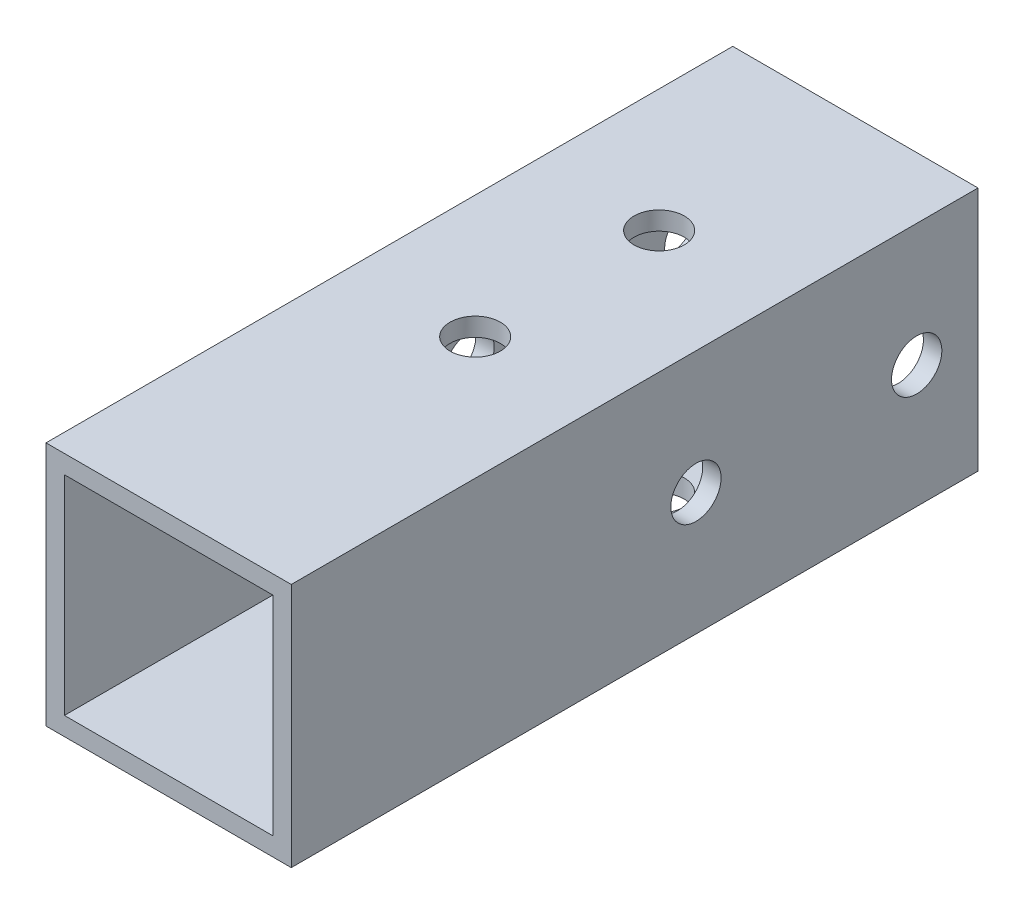
ISO-10303-21;
HEADER;
FILE_DESCRIPTION(('STEP AP214'),'2;1');
FILE_NAME('part.step','',(''),(''),'','','');
FILE_SCHEMA(('AUTOMOTIVE_DESIGN { 1 0 10303 214 1 1 1 1 }'));
ENDSEC;
DATA;
#1=APPLICATION_CONTEXT('core data for automotive mechanical design processes');
#2=APPLICATION_PROTOCOL_DEFINITION('international standard','automotive_design',2000,#1);
#3=PRODUCT_CONTEXT('',#1,'mechanical');
#4=PRODUCT('Part','Part','',(#3));
#5=PRODUCT_RELATED_PRODUCT_CATEGORY('part','',(#4));
#6=PRODUCT_DEFINITION_FORMATION('','',#4);
#7=PRODUCT_DEFINITION_CONTEXT('part definition',#1,'design');
#8=PRODUCT_DEFINITION('design','',#6,#7);
#9=PRODUCT_DEFINITION_SHAPE('','',#8);
#10=(LENGTH_UNIT() NAMED_UNIT(*) SI_UNIT(.MILLI.,.METRE.));
#11=(NAMED_UNIT(*) PLANE_ANGLE_UNIT() SI_UNIT($,.RADIAN.));
#12=(NAMED_UNIT(*) SI_UNIT($,.STERADIAN.) SOLID_ANGLE_UNIT());
#13=UNCERTAINTY_MEASURE_WITH_UNIT(LENGTH_MEASURE(1.E-05),#10,'distance_accuracy_value','');
#14=(GEOMETRIC_REPRESENTATION_CONTEXT(3) GLOBAL_UNCERTAINTY_ASSIGNED_CONTEXT((#13)) GLOBAL_UNIT_ASSIGNED_CONTEXT((#10,
#11,#12)) REPRESENTATION_CONTEXT('',''));
#15=CARTESIAN_POINT('',(0.,0.,0.));
#16=DIRECTION('',(0.,0.,1.));
#17=DIRECTION('',(1.,0.,0.));
#18=AXIS2_PLACEMENT_3D('',#15,#16,#17);
#19=CARTESIAN_POINT('',(0.,0.,56.));
#20=DIRECTION('',(0.,0.,1.));
#21=DIRECTION('',(1.,0.,0.));
#22=AXIS2_PLACEMENT_3D('',#19,#20,#21);
#23=PLANE('',#22);
#24=DIRECTION('',(0.,1.,0.));
#25=VECTOR('',#24,1.);
#26=CARTESIAN_POINT('',(10.,10.,56.));
#27=LINE('',#26,#25);
#28=CARTESIAN_POINT('',(10.,-10.,56.));
#29=VERTEX_POINT('',#28);
#30=CARTESIAN_POINT('',(10.,10.,56.));
#31=VERTEX_POINT('',#30);
#32=EDGE_CURVE('E138',#29,#31,#27,.T.);
#33=ORIENTED_EDGE('',*,*,#32,.T.);
#34=DIRECTION('',(-1.,0.,0.));
#35=VECTOR('',#34,1.);
#36=CARTESIAN_POINT('',(-10.,10.,56.));
#37=LINE('',#36,#35);
#38=CARTESIAN_POINT('',(-10.,10.,56.));
#39=VERTEX_POINT('',#38);
#40=EDGE_CURVE('E141',#31,#39,#37,.T.);
#41=ORIENTED_EDGE('',*,*,#40,.T.);
#42=DIRECTION('',(0.,-1.,0.));
#43=VECTOR('',#42,1.);
#44=CARTESIAN_POINT('',(-10.,10.,56.));
#45=LINE('',#44,#43);
#46=CARTESIAN_POINT('',(-10.,-10.,56.));
#47=VERTEX_POINT('',#46);
#48=EDGE_CURVE('E144',#39,#47,#45,.T.);
#49=ORIENTED_EDGE('',*,*,#48,.T.);
#50=DIRECTION('',(1.,0.,0.));
#51=VECTOR('',#50,1.);
#52=CARTESIAN_POINT('',(-10.,-10.,56.));
#53=LINE('',#52,#51);
#54=EDGE_CURVE('E146',#47,#29,#53,.T.);
#55=ORIENTED_EDGE('',*,*,#54,.T.);
#56=EDGE_LOOP('',(#33,#41,#49,#55));
#57=FACE_BOUND('',#56,.T.);
#58=DIRECTION('',(-1.,0.,0.));
#59=VECTOR('',#58,1.);
#60=CARTESIAN_POINT('',(-8.5,8.5,56.));
#61=LINE('',#60,#59);
#62=CARTESIAN_POINT('',(8.5,8.5,56.));
#63=VERTEX_POINT('',#62);
#64=CARTESIAN_POINT('',(-8.5,8.5,56.));
#65=VERTEX_POINT('',#64);
#66=EDGE_CURVE('E108',#63,#65,#61,.T.);
#67=ORIENTED_EDGE('',*,*,#66,.F.);
#68=DIRECTION('',(0.,1.,0.));
#69=VECTOR('',#68,1.);
#70=CARTESIAN_POINT('',(8.5,8.5,56.));
#71=LINE('',#70,#69);
#72=CARTESIAN_POINT('',(8.5,-8.5,56.));
#73=VERTEX_POINT('',#72);
#74=EDGE_CURVE('E100',#73,#63,#71,.T.);
#75=ORIENTED_EDGE('',*,*,#74,.F.);
#76=DIRECTION('',(1.,0.,0.));
#77=VECTOR('',#76,1.);
#78=CARTESIAN_POINT('',(-8.5,-8.5,56.));
#79=LINE('',#78,#77);
#80=CARTESIAN_POINT('',(-8.5,-8.5,56.));
#81=VERTEX_POINT('',#80);
#82=EDGE_CURVE('E122',#81,#73,#79,.T.);
#83=ORIENTED_EDGE('',*,*,#82,.F.);
#84=DIRECTION('',(0.,-1.,0.));
#85=VECTOR('',#84,1.);
#86=CARTESIAN_POINT('',(-8.5,8.5,56.));
#87=LINE('',#86,#85);
#88=EDGE_CURVE('E120',#65,#81,#87,.T.);
#89=ORIENTED_EDGE('',*,*,#88,.F.);
#90=EDGE_LOOP('',(#67,#75,#83,#89));
#91=FACE_BOUND('',#90,.T.);
#92=ADVANCED_FACE('F33',(#57,#91),#23,.T.);
#93=CARTESIAN_POINT('',(0.,0.,0.));
#94=DIRECTION('',(0.,0.,1.));
#95=DIRECTION('',(1.,0.,0.));
#96=AXIS2_PLACEMENT_3D('',#93,#94,#95);
#97=PLANE('',#96);
#98=DIRECTION('',(0.,1.,0.));
#99=VECTOR('',#98,1.);
#100=CARTESIAN_POINT('',(10.,10.,0.));
#101=LINE('',#100,#99);
#102=CARTESIAN_POINT('',(10.,-10.,0.));
#103=VERTEX_POINT('',#102);
#104=CARTESIAN_POINT('',(10.,10.,0.));
#105=VERTEX_POINT('',#104);
#106=EDGE_CURVE('E116',#103,#105,#101,.T.);
#107=ORIENTED_EDGE('',*,*,#106,.F.);
#108=DIRECTION('',(1.,0.,0.));
#109=VECTOR('',#108,1.);
#110=CARTESIAN_POINT('',(-10.,-10.,0.));
#111=LINE('',#110,#109);
#112=CARTESIAN_POINT('',(-10.,-10.,0.));
#113=VERTEX_POINT('',#112);
#114=EDGE_CURVE('E142',#113,#103,#111,.T.);
#115=ORIENTED_EDGE('',*,*,#114,.F.);
#116=DIRECTION('',(0.,-1.,0.));
#117=VECTOR('',#116,1.);
#118=CARTESIAN_POINT('',(-10.,10.,0.));
#119=LINE('',#118,#117);
#120=CARTESIAN_POINT('',(-10.,10.,0.));
#121=VERTEX_POINT('',#120);
#122=EDGE_CURVE('E153',#121,#113,#119,.T.);
#123=ORIENTED_EDGE('',*,*,#122,.F.);
#124=DIRECTION('',(-1.,0.,0.));
#125=VECTOR('',#124,1.);
#126=CARTESIAN_POINT('',(-10.,10.,0.));
#127=LINE('',#126,#125);
#128=EDGE_CURVE('E151',#105,#121,#127,.T.);
#129=ORIENTED_EDGE('',*,*,#128,.F.);
#130=EDGE_LOOP('',(#107,#115,#123,#129));
#131=FACE_BOUND('',#130,.T.);
#132=DIRECTION('',(0.,1.,0.));
#133=VECTOR('',#132,1.);
#134=CARTESIAN_POINT('',(8.5,8.5,0.));
#135=LINE('',#134,#133);
#136=CARTESIAN_POINT('',(8.5,-8.5,0.));
#137=VERTEX_POINT('',#136);
#138=CARTESIAN_POINT('',(8.5,8.5,0.));
#139=VERTEX_POINT('',#138);
#140=EDGE_CURVE('E58',#137,#139,#135,.T.);
#141=ORIENTED_EDGE('',*,*,#140,.T.);
#142=DIRECTION('',(-1.,0.,0.));
#143=VECTOR('',#142,1.);
#144=CARTESIAN_POINT('',(-8.5,8.5,0.));
#145=LINE('',#144,#143);
#146=CARTESIAN_POINT('',(-8.5,8.5,0.));
#147=VERTEX_POINT('',#146);
#148=EDGE_CURVE('E115',#139,#147,#145,.T.);
#149=ORIENTED_EDGE('',*,*,#148,.T.);
#150=DIRECTION('',(0.,-1.,0.));
#151=VECTOR('',#150,1.);
#152=CARTESIAN_POINT('',(-8.5,8.5,0.));
#153=LINE('',#152,#151);
#154=CARTESIAN_POINT('',(-8.5,-8.5,0.));
#155=VERTEX_POINT('',#154);
#156=EDGE_CURVE('E130',#147,#155,#153,.T.);
#157=ORIENTED_EDGE('',*,*,#156,.T.);
#158=DIRECTION('',(1.,0.,0.));
#159=VECTOR('',#158,1.);
#160=CARTESIAN_POINT('',(-8.5,-8.5,0.));
#161=LINE('',#160,#159);
#162=EDGE_CURVE('E109',#155,#137,#161,.T.);
#163=ORIENTED_EDGE('',*,*,#162,.T.);
#164=EDGE_LOOP('',(#141,#149,#157,#163));
#165=FACE_BOUND('',#164,.T.);
#166=ADVANCED_FACE('F225',(#131,#165),#97,.F.);
#167=CARTESIAN_POINT('',(10.,10.,56.));
#168=DIRECTION('',(-1.,0.,0.));
#169=DIRECTION('',(0.,0.,1.));
#170=AXIS2_PLACEMENT_3D('',#167,#168,#169);
#171=PLANE('',#170);
#172=CARTESIAN_POINT('',(10.,0.,23.));
#173=DIRECTION('',(-1.,0.,0.));
#174=DIRECTION('',(0.,0.,1.));
#175=AXIS2_PLACEMENT_3D('',#172,#173,#174);
#176=CIRCLE('',#175,2.04999999999999);
#177=CARTESIAN_POINT('',(10.,0.,25.05));
#178=VERTEX_POINT('',#177);
#179=EDGE_CURVE('E197',#178,#178,#176,.T.);
#180=ORIENTED_EDGE('',*,*,#179,.T.);
#181=EDGE_LOOP('',(#180));
#182=FACE_BOUND('',#181,.T.);
#183=CARTESIAN_POINT('',(10.,0.,5.));
#184=DIRECTION('',(-1.,0.,0.));
#185=DIRECTION('',(0.,0.,1.));
#186=AXIS2_PLACEMENT_3D('',#183,#184,#185);
#187=CIRCLE('',#186,2.05);
#188=CARTESIAN_POINT('',(10.,0.,7.05));
#189=VERTEX_POINT('',#188);
#190=EDGE_CURVE('E128',#189,#189,#187,.T.);
#191=ORIENTED_EDGE('',*,*,#190,.T.);
#192=EDGE_LOOP('',(#191));
#193=FACE_BOUND('',#192,.T.);
#194=ORIENTED_EDGE('',*,*,#106,.T.);
#195=DIRECTION('',(0.,0.,-1.));
#196=VECTOR('',#195,1.);
#197=CARTESIAN_POINT('',(10.,10.,56.));
#198=LINE('',#197,#196);
#199=EDGE_CURVE('E11',#31,#105,#198,.T.);
#200=ORIENTED_EDGE('',*,*,#199,.F.);
#201=ORIENTED_EDGE('',*,*,#32,.F.);
#202=DIRECTION('',(0.,0.,-1.));
#203=VECTOR('',#202,1.);
#204=CARTESIAN_POINT('',(10.,-10.,56.));
#205=LINE('',#204,#203);
#206=EDGE_CURVE('E148',#29,#103,#205,.T.);
#207=ORIENTED_EDGE('',*,*,#206,.T.);
#208=EDGE_LOOP('',(#194,#200,#201,#207));
#209=FACE_BOUND('',#208,.T.);
#210=ADVANCED_FACE('F35',(#182,#193,#209),#171,.F.);
#211=CARTESIAN_POINT('',(-10.,10.,56.));
#212=DIRECTION('',(0.,-1.,0.));
#213=DIRECTION('',(0.,0.,-1.));
#214=AXIS2_PLACEMENT_3D('',#211,#212,#213);
#215=PLANE('',#214);
#216=CARTESIAN_POINT('',(0.,10.,31.));
#217=DIRECTION('',(0.,1.,0.));
#218=DIRECTION('',(0.,0.,1.));
#219=AXIS2_PLACEMENT_3D('',#216,#217,#218);
#220=CIRCLE('',#219,2.05);
#221=CARTESIAN_POINT('',(0.,10.,33.05));
#222=VERTEX_POINT('',#221);
#223=EDGE_CURVE('E253',#222,#222,#220,.T.);
#224=ORIENTED_EDGE('',*,*,#223,.F.);
#225=EDGE_LOOP('',(#224));
#226=FACE_BOUND('',#225,.T.);
#227=CARTESIAN_POINT('',(0.,10.,16.));
#228=DIRECTION('',(0.,1.,0.));
#229=DIRECTION('',(0.,0.,1.));
#230=AXIS2_PLACEMENT_3D('',#227,#228,#229);
#231=CIRCLE('',#230,2.05);
#232=CARTESIAN_POINT('',(0.,10.,18.05));
#233=VERTEX_POINT('',#232);
#234=EDGE_CURVE('E175',#233,#233,#231,.T.);
#235=ORIENTED_EDGE('',*,*,#234,.F.);
#236=EDGE_LOOP('',(#235));
#237=FACE_BOUND('',#236,.T.);
#238=ORIENTED_EDGE('',*,*,#128,.T.);
#239=DIRECTION('',(0.,0.,-1.));
#240=VECTOR('',#239,1.);
#241=CARTESIAN_POINT('',(-10.,10.,56.));
#242=LINE('',#241,#240);
#243=EDGE_CURVE('E42',#39,#121,#242,.T.);
#244=ORIENTED_EDGE('',*,*,#243,.F.);
#245=ORIENTED_EDGE('',*,*,#40,.F.);
#246=ORIENTED_EDGE('',*,*,#199,.T.);
#247=EDGE_LOOP('',(#238,#244,#245,#246));
#248=FACE_BOUND('',#247,.T.);
#249=ADVANCED_FACE('F242',(#226,#237,#248),#215,.F.);
#250=CARTESIAN_POINT('',(-10.,10.,56.));
#251=DIRECTION('',(1.,0.,0.));
#252=DIRECTION('',(0.,1.,0.));
#253=AXIS2_PLACEMENT_3D('',#250,#251,#252);
#254=PLANE('',#253);
#255=CARTESIAN_POINT('',(-10.,0.,23.));
#256=DIRECTION('',(-1.,0.,0.));
#257=DIRECTION('',(0.,-1.,0.));
#258=AXIS2_PLACEMENT_3D('',#255,#256,#257);
#259=CIRCLE('',#258,2.04999999999999);
#260=CARTESIAN_POINT('',(-10.,-2.04999999999999,23.));
#261=VERTEX_POINT('',#260);
#262=EDGE_CURVE('E171',#261,#261,#259,.T.);
#263=ORIENTED_EDGE('',*,*,#262,.F.);
#264=EDGE_LOOP('',(#263));
#265=FACE_BOUND('',#264,.T.);
#266=CARTESIAN_POINT('',(-10.,0.,5.));
#267=DIRECTION('',(-1.,0.,0.));
#268=DIRECTION('',(0.,-1.,0.));
#269=AXIS2_PLACEMENT_3D('',#266,#267,#268);
#270=CIRCLE('',#269,2.05);
#271=CARTESIAN_POINT('',(-10.,-2.05,5.));
#272=VERTEX_POINT('',#271);
#273=EDGE_CURVE('E167',#272,#272,#270,.T.);
#274=ORIENTED_EDGE('',*,*,#273,.F.);
#275=EDGE_LOOP('',(#274));
#276=FACE_BOUND('',#275,.T.);
#277=ORIENTED_EDGE('',*,*,#122,.T.);
#278=DIRECTION('',(0.,0.,-1.));
#279=VECTOR('',#278,1.);
#280=CARTESIAN_POINT('',(-10.,-10.,56.));
#281=LINE('',#280,#279);
#282=EDGE_CURVE('E158',#47,#113,#281,.T.);
#283=ORIENTED_EDGE('',*,*,#282,.F.);
#284=ORIENTED_EDGE('',*,*,#48,.F.);
#285=ORIENTED_EDGE('',*,*,#243,.T.);
#286=EDGE_LOOP('',(#277,#283,#284,#285));
#287=FACE_BOUND('',#286,.T.);
#288=ADVANCED_FACE('F239',(#265,#276,#287),#254,.F.);
#289=CARTESIAN_POINT('',(-10.,-10.,56.));
#290=DIRECTION('',(0.,1.,0.));
#291=DIRECTION('',(0.,0.,1.));
#292=AXIS2_PLACEMENT_3D('',#289,#290,#291);
#293=PLANE('',#292);
#294=CARTESIAN_POINT('',(0.,-10.,31.));
#295=DIRECTION('',(0.,1.,0.));
#296=DIRECTION('',(0.,0.,1.));
#297=AXIS2_PLACEMENT_3D('',#294,#295,#296);
#298=CIRCLE('',#297,2.05);
#299=CARTESIAN_POINT('',(0.,-10.,33.05));
#300=VERTEX_POINT('',#299);
#301=EDGE_CURVE('E182',#300,#300,#298,.T.);
#302=ORIENTED_EDGE('',*,*,#301,.T.);
#303=EDGE_LOOP('',(#302));
#304=FACE_BOUND('',#303,.T.);
#305=CARTESIAN_POINT('',(0.,-10.,16.));
#306=DIRECTION('',(0.,1.,0.));
#307=DIRECTION('',(0.,0.,1.));
#308=AXIS2_PLACEMENT_3D('',#305,#306,#307);
#309=CIRCLE('',#308,2.05);
#310=CARTESIAN_POINT('',(0.,-10.,18.05));
#311=VERTEX_POINT('',#310);
#312=EDGE_CURVE('E179',#311,#311,#309,.T.);
#313=ORIENTED_EDGE('',*,*,#312,.T.);
#314=EDGE_LOOP('',(#313));
#315=FACE_BOUND('',#314,.T.);
#316=ORIENTED_EDGE('',*,*,#114,.T.);
#317=ORIENTED_EDGE('',*,*,#206,.F.);
#318=ORIENTED_EDGE('',*,*,#54,.F.);
#319=ORIENTED_EDGE('',*,*,#282,.T.);
#320=EDGE_LOOP('',(#316,#317,#318,#319));
#321=FACE_BOUND('',#320,.T.);
#322=ADVANCED_FACE('F236',(#304,#315,#321),#293,.F.);
#323=CARTESIAN_POINT('',(8.5,8.5,56.));
#324=DIRECTION('',(-1.,0.,0.));
#325=DIRECTION('',(0.,0.,1.));
#326=AXIS2_PLACEMENT_3D('',#323,#324,#325);
#327=PLANE('',#326);
#328=CARTESIAN_POINT('',(8.5,0.,23.));
#329=DIRECTION('',(-1.,0.,0.));
#330=DIRECTION('',(0.,0.,1.));
#331=AXIS2_PLACEMENT_3D('',#328,#329,#330);
#332=CIRCLE('',#331,2.04999999999999);
#333=CARTESIAN_POINT('',(8.5,0.,25.05));
#334=VERTEX_POINT('',#333);
#335=EDGE_CURVE('E170',#334,#334,#332,.T.);
#336=ORIENTED_EDGE('',*,*,#335,.F.);
#337=EDGE_LOOP('',(#336));
#338=FACE_BOUND('',#337,.T.);
#339=CARTESIAN_POINT('',(8.5,0.,5.));
#340=DIRECTION('',(-1.,0.,0.));
#341=DIRECTION('',(0.,0.,1.));
#342=AXIS2_PLACEMENT_3D('',#339,#340,#341);
#343=CIRCLE('',#342,2.05);
#344=CARTESIAN_POINT('',(8.5,0.,7.05));
#345=VERTEX_POINT('',#344);
#346=EDGE_CURVE('E166',#345,#345,#343,.T.);
#347=ORIENTED_EDGE('',*,*,#346,.F.);
#348=EDGE_LOOP('',(#347));
#349=FACE_BOUND('',#348,.T.);
#350=ORIENTED_EDGE('',*,*,#140,.F.);
#351=DIRECTION('',(0.,0.,-1.));
#352=VECTOR('',#351,1.);
#353=CARTESIAN_POINT('',(8.5,-8.5,56.));
#354=LINE('',#353,#352);
#355=EDGE_CURVE('E104',#73,#137,#354,.T.);
#356=ORIENTED_EDGE('',*,*,#355,.F.);
#357=ORIENTED_EDGE('',*,*,#74,.T.);
#358=DIRECTION('',(0.,0.,-1.));
#359=VECTOR('',#358,1.);
#360=CARTESIAN_POINT('',(8.5,8.5,56.));
#361=LINE('',#360,#359);
#362=EDGE_CURVE('E103',#63,#139,#361,.T.);
#363=ORIENTED_EDGE('',*,*,#362,.T.);
#364=EDGE_LOOP('',(#350,#356,#357,#363));
#365=FACE_BOUND('',#364,.T.);
#366=ADVANCED_FACE('F102',(#338,#349,#365),#327,.T.);
#367=CARTESIAN_POINT('',(-8.5,8.5,56.));
#368=DIRECTION('',(0.,-1.,0.));
#369=DIRECTION('',(0.,0.,-1.));
#370=AXIS2_PLACEMENT_3D('',#367,#368,#369);
#371=PLANE('',#370);
#372=CARTESIAN_POINT('',(0.,8.5,31.));
#373=DIRECTION('',(0.,-1.,0.));
#374=DIRECTION('',(0.,0.,-1.));
#375=AXIS2_PLACEMENT_3D('',#372,#373,#374);
#376=CIRCLE('',#375,2.05);
#377=CARTESIAN_POINT('',(0.,8.5,28.95));
#378=VERTEX_POINT('',#377);
#379=EDGE_CURVE('E187',#378,#378,#376,.T.);
#380=ORIENTED_EDGE('',*,*,#379,.F.);
#381=EDGE_LOOP('',(#380));
#382=FACE_BOUND('',#381,.T.);
#383=CARTESIAN_POINT('',(0.,8.5,16.));
#384=DIRECTION('',(0.,-1.,0.));
#385=DIRECTION('',(0.,0.,-1.));
#386=AXIS2_PLACEMENT_3D('',#383,#384,#385);
#387=CIRCLE('',#386,2.05);
#388=CARTESIAN_POINT('',(0.,8.5,13.95));
#389=VERTEX_POINT('',#388);
#390=EDGE_CURVE('E174',#389,#389,#387,.T.);
#391=ORIENTED_EDGE('',*,*,#390,.F.);
#392=EDGE_LOOP('',(#391));
#393=FACE_BOUND('',#392,.T.);
#394=ORIENTED_EDGE('',*,*,#148,.F.);
#395=ORIENTED_EDGE('',*,*,#362,.F.);
#396=ORIENTED_EDGE('',*,*,#66,.T.);
#397=DIRECTION('',(0.,0.,-1.));
#398=VECTOR('',#397,1.);
#399=CARTESIAN_POINT('',(-8.5,8.5,56.));
#400=LINE('',#399,#398);
#401=EDGE_CURVE('E117',#65,#147,#400,.T.);
#402=ORIENTED_EDGE('',*,*,#401,.T.);
#403=EDGE_LOOP('',(#394,#395,#396,#402));
#404=FACE_BOUND('',#403,.T.);
#405=ADVANCED_FACE('F112',(#382,#393,#404),#371,.T.);
#406=CARTESIAN_POINT('',(-8.5,8.5,56.));
#407=DIRECTION('',(1.,0.,0.));
#408=DIRECTION('',(0.,0.,-1.));
#409=AXIS2_PLACEMENT_3D('',#406,#407,#408);
#410=PLANE('',#409);
#411=CARTESIAN_POINT('',(-8.5,0.,23.));
#412=DIRECTION('',(1.,0.,0.));
#413=DIRECTION('',(0.,0.,-1.));
#414=AXIS2_PLACEMENT_3D('',#411,#412,#413);
#415=CIRCLE('',#414,2.04999999999999);
#416=CARTESIAN_POINT('',(-8.5,0.,20.95));
#417=VERTEX_POINT('',#416);
#418=EDGE_CURVE('E168',#417,#417,#415,.T.);
#419=ORIENTED_EDGE('',*,*,#418,.F.);
#420=EDGE_LOOP('',(#419));
#421=FACE_BOUND('',#420,.T.);
#422=CARTESIAN_POINT('',(-8.5,0.,5.));
#423=DIRECTION('',(1.,0.,0.));
#424=DIRECTION('',(0.,0.,-1.));
#425=AXIS2_PLACEMENT_3D('',#422,#423,#424);
#426=CIRCLE('',#425,2.05);
#427=CARTESIAN_POINT('',(-8.5,0.,2.95));
#428=VERTEX_POINT('',#427);
#429=EDGE_CURVE('E163',#428,#428,#426,.T.);
#430=ORIENTED_EDGE('',*,*,#429,.F.);
#431=EDGE_LOOP('',(#430));
#432=FACE_BOUND('',#431,.T.);
#433=ORIENTED_EDGE('',*,*,#156,.F.);
#434=ORIENTED_EDGE('',*,*,#401,.F.);
#435=ORIENTED_EDGE('',*,*,#88,.T.);
#436=DIRECTION('',(0.,0.,-1.));
#437=VECTOR('',#436,1.);
#438=CARTESIAN_POINT('',(-8.5,-8.5,56.));
#439=LINE('',#438,#437);
#440=EDGE_CURVE('E50',#81,#155,#439,.T.);
#441=ORIENTED_EDGE('',*,*,#440,.T.);
#442=EDGE_LOOP('',(#433,#434,#435,#441));
#443=FACE_BOUND('',#442,.T.);
#444=ADVANCED_FACE('F270',(#421,#432,#443),#410,.T.);
#445=CARTESIAN_POINT('',(-8.5,-8.5,56.));
#446=DIRECTION('',(0.,1.,0.));
#447=DIRECTION('',(0.,0.,1.));
#448=AXIS2_PLACEMENT_3D('',#445,#446,#447);
#449=PLANE('',#448);
#450=CARTESIAN_POINT('',(0.,-8.5,31.));
#451=DIRECTION('',(0.,1.,0.));
#452=DIRECTION('',(0.,0.,1.));
#453=AXIS2_PLACEMENT_3D('',#450,#451,#452);
#454=CIRCLE('',#453,2.05);
#455=CARTESIAN_POINT('',(0.,-8.5,33.05));
#456=VERTEX_POINT('',#455);
#457=EDGE_CURVE('E37',#456,#456,#454,.T.);
#458=ORIENTED_EDGE('',*,*,#457,.F.);
#459=EDGE_LOOP('',(#458));
#460=FACE_BOUND('',#459,.T.);
#461=CARTESIAN_POINT('',(0.,-8.5,16.));
#462=DIRECTION('',(0.,1.,0.));
#463=DIRECTION('',(0.,0.,1.));
#464=AXIS2_PLACEMENT_3D('',#461,#462,#463);
#465=CIRCLE('',#464,2.05);
#466=CARTESIAN_POINT('',(0.,-8.5,18.05));
#467=VERTEX_POINT('',#466);
#468=EDGE_CURVE('E172',#467,#467,#465,.T.);
#469=ORIENTED_EDGE('',*,*,#468,.F.);
#470=EDGE_LOOP('',(#469));
#471=FACE_BOUND('',#470,.T.);
#472=ORIENTED_EDGE('',*,*,#162,.F.);
#473=ORIENTED_EDGE('',*,*,#440,.F.);
#474=ORIENTED_EDGE('',*,*,#82,.T.);
#475=ORIENTED_EDGE('',*,*,#355,.T.);
#476=EDGE_LOOP('',(#472,#473,#474,#475));
#477=FACE_BOUND('',#476,.T.);
#478=ADVANCED_FACE('F221',(#460,#471,#477),#449,.T.);
#479=CARTESIAN_POINT('',(13.,0.,5.));
#480=DIRECTION('',(-1.,0.,0.));
#481=DIRECTION('',(0.,-1.,0.));
#482=AXIS2_PLACEMENT_3D('',#479,#480,#481);
#483=CYLINDRICAL_SURFACE('',#482,2.05);
#484=ORIENTED_EDGE('',*,*,#429,.T.);
#485=EDGE_LOOP('',(#484));
#486=FACE_BOUND('',#485,.T.);
#487=ORIENTED_EDGE('',*,*,#273,.T.);
#488=EDGE_LOOP('',(#487));
#489=FACE_BOUND('',#488,.T.);
#490=ADVANCED_FACE('F211',(#486,#489),#483,.F.);
#491=ORIENTED_EDGE('',*,*,#346,.T.);
#492=EDGE_LOOP('',(#491));
#493=FACE_BOUND('',#492,.T.);
#494=ORIENTED_EDGE('',*,*,#190,.F.);
#495=EDGE_LOOP('',(#494));
#496=FACE_BOUND('',#495,.T.);
#497=ADVANCED_FACE('F208',(#493,#496),#483,.F.);
#498=CARTESIAN_POINT('',(13.,0.,23.));
#499=DIRECTION('',(-1.,0.,0.));
#500=DIRECTION('',(0.,-1.,0.));
#501=AXIS2_PLACEMENT_3D('',#498,#499,#500);
#502=CYLINDRICAL_SURFACE('',#501,2.04999999999999);
#503=ORIENTED_EDGE('',*,*,#418,.T.);
#504=EDGE_LOOP('',(#503));
#505=FACE_BOUND('',#504,.T.);
#506=ORIENTED_EDGE('',*,*,#262,.T.);
#507=EDGE_LOOP('',(#506));
#508=FACE_BOUND('',#507,.T.);
#509=ADVANCED_FACE('F210',(#505,#508),#502,.F.);
#510=ORIENTED_EDGE('',*,*,#335,.T.);
#511=EDGE_LOOP('',(#510));
#512=FACE_BOUND('',#511,.T.);
#513=ORIENTED_EDGE('',*,*,#179,.F.);
#514=EDGE_LOOP('',(#513));
#515=FACE_BOUND('',#514,.T.);
#516=ADVANCED_FACE('F218',(#512,#515),#502,.F.);
#517=CARTESIAN_POINT('',(0.,-13.,16.));
#518=DIRECTION('',(0.,1.,0.));
#519=DIRECTION('',(0.,0.,1.));
#520=AXIS2_PLACEMENT_3D('',#517,#518,#519);
#521=CYLINDRICAL_SURFACE('',#520,2.05);
#522=ORIENTED_EDGE('',*,*,#468,.T.);
#523=EDGE_LOOP('',(#522));
#524=FACE_BOUND('',#523,.T.);
#525=ORIENTED_EDGE('',*,*,#312,.F.);
#526=EDGE_LOOP('',(#525));
#527=FACE_BOUND('',#526,.T.);
#528=ADVANCED_FACE('F293',(#524,#527),#521,.F.);
#529=ORIENTED_EDGE('',*,*,#390,.T.);
#530=EDGE_LOOP('',(#529));
#531=FACE_BOUND('',#530,.T.);
#532=ORIENTED_EDGE('',*,*,#234,.T.);
#533=EDGE_LOOP('',(#532));
#534=FACE_BOUND('',#533,.T.);
#535=ADVANCED_FACE('F290',(#531,#534),#521,.F.);
#536=CARTESIAN_POINT('',(0.,-13.,31.));
#537=DIRECTION('',(0.,1.,0.));
#538=DIRECTION('',(0.,0.,1.));
#539=AXIS2_PLACEMENT_3D('',#536,#537,#538);
#540=CYLINDRICAL_SURFACE('',#539,2.05);
#541=ORIENTED_EDGE('',*,*,#457,.T.);
#542=EDGE_LOOP('',(#541));
#543=FACE_BOUND('',#542,.T.);
#544=ORIENTED_EDGE('',*,*,#301,.F.);
#545=EDGE_LOOP('',(#544));
#546=FACE_BOUND('',#545,.T.);
#547=ADVANCED_FACE('F292',(#543,#546),#540,.F.);
#548=ORIENTED_EDGE('',*,*,#379,.T.);
#549=EDGE_LOOP('',(#548));
#550=FACE_BOUND('',#549,.T.);
#551=ORIENTED_EDGE('',*,*,#223,.T.);
#552=EDGE_LOOP('',(#551));
#553=FACE_BOUND('',#552,.T.);
#554=ADVANCED_FACE('F299',(#550,#553),#540,.F.);
#555=CLOSED_SHELL('',(#92,#166,#210,#249,#288,#322,#366,#405,#444,#478,#490,#497,#509,#516,#528,
#535,#547,#554));
#556=MANIFOLD_SOLID_BREP('B2',#555);
#557=ADVANCED_BREP_SHAPE_REPRESENTATION('',(#18,#556),#14);
#558=SHAPE_DEFINITION_REPRESENTATION(#9,#557);
ENDSEC;
END-ISO-10303-21;
